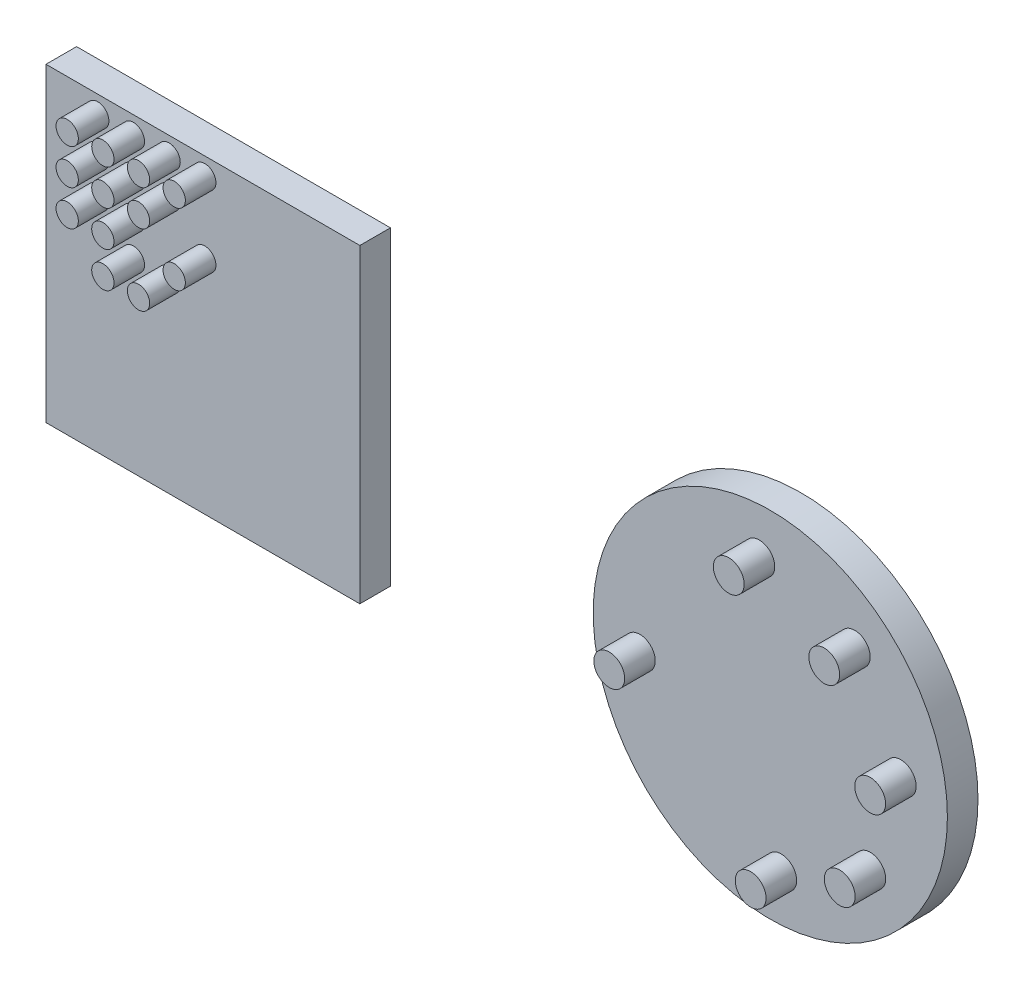
ISO-10303-21;
HEADER;
FILE_DESCRIPTION(('STEP AP214'),'2;1');
FILE_NAME('part.step','',(''),(''),'','','');
FILE_SCHEMA(('AUTOMOTIVE_DESIGN { 1 0 10303 214 1 1 1 1 }'));
ENDSEC;
DATA;
#1=APPLICATION_CONTEXT('core data for automotive mechanical design processes');
#2=APPLICATION_PROTOCOL_DEFINITION('international standard','automotive_design',2000,#1);
#3=PRODUCT_CONTEXT('',#1,'mechanical');
#4=PRODUCT('Part','Part','',(#3));
#5=PRODUCT_RELATED_PRODUCT_CATEGORY('part','',(#4));
#6=PRODUCT_DEFINITION_FORMATION('','',#4);
#7=PRODUCT_DEFINITION_CONTEXT('part definition',#1,'design');
#8=PRODUCT_DEFINITION('design','',#6,#7);
#9=PRODUCT_DEFINITION_SHAPE('','',#8);
#10=(LENGTH_UNIT() NAMED_UNIT(*) SI_UNIT(.MILLI.,.METRE.));
#11=(NAMED_UNIT(*) PLANE_ANGLE_UNIT() SI_UNIT($,.RADIAN.));
#12=(NAMED_UNIT(*) SI_UNIT($,.STERADIAN.) SOLID_ANGLE_UNIT());
#13=UNCERTAINTY_MEASURE_WITH_UNIT(LENGTH_MEASURE(1.E-05),#10,'distance_accuracy_value','');
#14=(GEOMETRIC_REPRESENTATION_CONTEXT(3) GLOBAL_UNCERTAINTY_ASSIGNED_CONTEXT((#13)) GLOBAL_UNIT_ASSIGNED_CONTEXT((#10,
#11,#12)) REPRESENTATION_CONTEXT('',''));
#15=CARTESIAN_POINT('',(0.,0.,0.));
#16=DIRECTION('',(0.,0.,1.));
#17=DIRECTION('',(1.,0.,0.));
#18=AXIS2_PLACEMENT_3D('',#15,#16,#17);
#19=CARTESIAN_POINT('',(1372.54032856538,-312.890998646338,60.));
#20=DIRECTION('',(0.,0.,-1.));
#21=DIRECTION('',(-1.,0.,0.));
#22=AXIS2_PLACEMENT_3D('',#19,#20,#21);
#23=CYLINDRICAL_SURFACE('',#22,347.526096984866);
#24=CARTESIAN_POINT('',(1372.54032856538,-312.890998646338,60.));
#25=DIRECTION('',(0.,0.,1.));
#26=DIRECTION('',(1.,0.,0.));
#27=AXIS2_PLACEMENT_3D('',#24,#25,#26);
#28=CIRCLE('',#27,347.526096984866);
#29=CARTESIAN_POINT('',(1720.06642555024,-312.890998646338,60.));
#30=VERTEX_POINT('',#29);
#31=EDGE_CURVE('E11',#30,#30,#28,.T.);
#32=ORIENTED_EDGE('',*,*,#31,.F.);
#33=EDGE_LOOP('',(#32));
#34=FACE_BOUND('',#33,.T.);
#35=CARTESIAN_POINT('',(1372.54032856538,-312.890998646338,0.));
#36=DIRECTION('',(0.,0.,1.));
#37=DIRECTION('',(1.,0.,0.));
#38=AXIS2_PLACEMENT_3D('',#35,#36,#37);
#39=CIRCLE('',#38,347.526096984866);
#40=CARTESIAN_POINT('',(1720.06642555024,-312.890998646338,0.));
#41=VERTEX_POINT('',#40);
#42=EDGE_CURVE('E46',#41,#41,#39,.T.);
#43=ORIENTED_EDGE('',*,*,#42,.T.);
#44=EDGE_LOOP('',(#43));
#45=FACE_BOUND('',#44,.T.);
#46=ADVANCED_FACE('F43',(#34,#45),#23,.T.);
#47=CARTESIAN_POINT('',(1372.54032856538,-312.890998646338,60.));
#48=DIRECTION('',(0.,0.,1.));
#49=DIRECTION('',(1.,0.,0.));
#50=AXIS2_PLACEMENT_3D('',#47,#48,#49);
#51=PLANE('',#50);
#52=CARTESIAN_POINT('',(1628.50942504009,-291.402980136955,60.));
#53=DIRECTION('',(0.,0.,1.));
#54=DIRECTION('',(0.707106781186556,-0.707106781186539,0.));
#55=AXIS2_PLACEMENT_3D('',#52,#53,#54);
#56=CIRCLE('',#55,30.2418001890678);
#57=CARTESIAN_POINT('',(1649.89360702907,-312.787162125933,60.));
#58=VERTEX_POINT('',#57);
#59=EDGE_CURVE('E85',#58,#58,#56,.T.);
#60=ORIENTED_EDGE('',*,*,#59,.F.);
#61=EDGE_LOOP('',(#60));
#62=FACE_BOUND('',#61,.T.);
#63=CARTESIAN_POINT('',(1568.73213605908,-478.694158935552,60.));
#64=DIRECTION('',(0.,0.,1.));
#65=DIRECTION('',(0.,-1.,0.));
#66=AXIS2_PLACEMENT_3D('',#63,#64,#65);
#67=CIRCLE('',#66,30.2418001890678);
#68=CARTESIAN_POINT('',(1568.73213605908,-508.935959124619,60.));
#69=VERTEX_POINT('',#68);
#70=EDGE_CURVE('E79',#69,#69,#67,.T.);
#71=ORIENTED_EDGE('',*,*,#70,.F.);
#72=EDGE_LOOP('',(#71));
#73=FACE_BOUND('',#72,.T.);
#74=CARTESIAN_POINT('',(1394.02834707476,-568.860095121047,60.));
#75=DIRECTION('',(0.,0.,1.));
#76=DIRECTION('',(-0.707106781186541,-0.707106781186554,0.));
#77=AXIS2_PLACEMENT_3D('',#74,#75,#76);
#78=CIRCLE('',#77,30.2418001890678);
#79=CARTESIAN_POINT('',(1372.64416508578,-590.244277110025,60.));
#80=VERTEX_POINT('',#79);
#81=EDGE_CURVE('E73',#80,#80,#78,.T.);
#82=ORIENTED_EDGE('',*,*,#81,.F.);
#83=EDGE_LOOP('',(#82));
#84=FACE_BOUND('',#83,.T.);
#85=CARTESIAN_POINT('',(1116.57123209067,-334.37901715572,60.));
#86=DIRECTION('',(0.,0.,1.));
#87=DIRECTION('',(-0.707106781186551,0.707106781186544,0.));
#88=AXIS2_PLACEMENT_3D('',#85,#86,#87);
#89=CIRCLE('',#88,30.2418001890678);
#90=CARTESIAN_POINT('',(1095.18705010169,-312.994835166741,60.));
#91=VERTEX_POINT('',#90);
#92=EDGE_CURVE('E67',#91,#91,#89,.T.);
#93=ORIENTED_EDGE('',*,*,#92,.F.);
#94=EDGE_LOOP('',(#93));
#95=FACE_BOUND('',#94,.T.);
#96=CARTESIAN_POINT('',(1351.052310056,-56.9219021716301,60.));
#97=DIRECTION('',(0.,0.,1.));
#98=DIRECTION('',(0.707106781186546,0.707106781186549,0.));
#99=AXIS2_PLACEMENT_3D('',#96,#97,#98);
#100=CIRCLE('',#99,30.2418001890678);
#101=CARTESIAN_POINT('',(1372.43649204498,-35.5377201826516,60.));
#102=VERTEX_POINT('',#101);
#103=EDGE_CURVE('E61',#102,#102,#100,.T.);
#104=ORIENTED_EDGE('',*,*,#103,.F.);
#105=EDGE_LOOP('',(#104));
#106=FACE_BOUND('',#105,.T.);
#107=CARTESIAN_POINT('',(1538.34348885459,-116.699191152634,60.));
#108=DIRECTION('',(0.,0.,1.));
#109=DIRECTION('',(1.,0.,0.));
#110=AXIS2_PLACEMENT_3D('',#107,#108,#109);
#111=CIRCLE('',#110,30.2418001890678);
#112=CARTESIAN_POINT('',(1568.58528904366,-116.699191152634,60.));
#113=VERTEX_POINT('',#112);
#114=EDGE_CURVE('E55',#113,#113,#111,.T.);
#115=ORIENTED_EDGE('',*,*,#114,.F.);
#116=EDGE_LOOP('',(#115));
#117=FACE_BOUND('',#116,.T.);
#118=ORIENTED_EDGE('',*,*,#31,.T.);
#119=EDGE_LOOP('',(#118));
#120=FACE_BOUND('',#119,.T.);
#121=ADVANCED_FACE('F100',(#62,#73,#84,#95,#106,#117,#120),#51,.T.);
#122=CARTESIAN_POINT('',(1372.54032856538,-312.890998646338,0.));
#123=DIRECTION('',(0.,0.,1.));
#124=DIRECTION('',(1.,0.,0.));
#125=AXIS2_PLACEMENT_3D('',#122,#123,#124);
#126=PLANE('',#125);
#127=ORIENTED_EDGE('',*,*,#42,.F.);
#128=EDGE_LOOP('',(#127));
#129=FACE_BOUND('',#128,.T.);
#130=ADVANCED_FACE('F103',(#129),#126,.F.);
#131=CARTESIAN_POINT('',(1538.34348885459,-116.699191152634,120.));
#132=DIRECTION('',(0.,0.,-1.));
#133=DIRECTION('',(-1.,0.,0.));
#134=AXIS2_PLACEMENT_3D('',#131,#132,#133);
#135=CYLINDRICAL_SURFACE('',#134,30.2418001890678);
#136=CARTESIAN_POINT('',(1538.34348885459,-116.699191152634,120.));
#137=DIRECTION('',(0.,0.,1.));
#138=DIRECTION('',(1.,0.,0.));
#139=AXIS2_PLACEMENT_3D('',#136,#137,#138);
#140=CIRCLE('',#139,30.2418001890678);
#141=CARTESIAN_POINT('',(1568.58528904366,-116.699191152634,120.));
#142=VERTEX_POINT('',#141);
#143=EDGE_CURVE('E53',#142,#142,#140,.T.);
#144=ORIENTED_EDGE('',*,*,#143,.F.);
#145=EDGE_LOOP('',(#144));
#146=FACE_BOUND('',#145,.T.);
#147=ORIENTED_EDGE('',*,*,#114,.T.);
#148=EDGE_LOOP('',(#147));
#149=FACE_BOUND('',#148,.T.);
#150=ADVANCED_FACE('F115',(#146,#149),#135,.T.);
#151=CARTESIAN_POINT('',(1538.34348885459,-116.699191152634,120.));
#152=DIRECTION('',(0.,0.,1.));
#153=DIRECTION('',(1.,0.,0.));
#154=AXIS2_PLACEMENT_3D('',#151,#152,#153);
#155=PLANE('',#154);
#156=ORIENTED_EDGE('',*,*,#143,.T.);
#157=EDGE_LOOP('',(#156));
#158=FACE_BOUND('',#157,.T.);
#159=ADVANCED_FACE('F117',(#158),#155,.T.);
#160=CARTESIAN_POINT('',(1351.052310056,-56.9219021716301,120.));
#161=DIRECTION('',(0.,0.,-1.));
#162=DIRECTION('',(-1.,0.,0.));
#163=AXIS2_PLACEMENT_3D('',#160,#161,#162);
#164=CYLINDRICAL_SURFACE('',#163,30.2418001890678);
#165=CARTESIAN_POINT('',(1351.052310056,-56.9219021716301,120.));
#166=DIRECTION('',(0.,0.,1.));
#167=DIRECTION('',(0.707106781186546,0.707106781186549,0.));
#168=AXIS2_PLACEMENT_3D('',#165,#166,#167);
#169=CIRCLE('',#168,30.2418001890678);
#170=CARTESIAN_POINT('',(1372.43649204498,-35.5377201826516,120.));
#171=VERTEX_POINT('',#170);
#172=EDGE_CURVE('E58',#171,#171,#169,.T.);
#173=ORIENTED_EDGE('',*,*,#172,.F.);
#174=EDGE_LOOP('',(#173));
#175=FACE_BOUND('',#174,.T.);
#176=ORIENTED_EDGE('',*,*,#103,.T.);
#177=EDGE_LOOP('',(#176));
#178=FACE_BOUND('',#177,.T.);
#179=ADVANCED_FACE('F124',(#175,#178),#164,.T.);
#180=CARTESIAN_POINT('',(1351.052310056,-56.9219021716301,120.));
#181=DIRECTION('',(0.,0.,1.));
#182=DIRECTION('',(0.707106781186546,0.707106781186549,0.));
#183=AXIS2_PLACEMENT_3D('',#180,#181,#182);
#184=PLANE('',#183);
#185=ORIENTED_EDGE('',*,*,#172,.T.);
#186=EDGE_LOOP('',(#185));
#187=FACE_BOUND('',#186,.T.);
#188=ADVANCED_FACE('F162',(#187),#184,.T.);
#189=CARTESIAN_POINT('',(1116.57123209067,-334.37901715572,120.));
#190=DIRECTION('',(0.,0.,-1.));
#191=DIRECTION('',(-1.,0.,0.));
#192=AXIS2_PLACEMENT_3D('',#189,#190,#191);
#193=CYLINDRICAL_SURFACE('',#192,30.2418001890678);
#194=CARTESIAN_POINT('',(1116.57123209067,-334.37901715572,120.));
#195=DIRECTION('',(0.,0.,1.));
#196=DIRECTION('',(-0.707106781186551,0.707106781186544,0.));
#197=AXIS2_PLACEMENT_3D('',#194,#195,#196);
#198=CIRCLE('',#197,30.2418001890678);
#199=CARTESIAN_POINT('',(1095.18705010169,-312.994835166741,120.));
#200=VERTEX_POINT('',#199);
#201=EDGE_CURVE('E64',#200,#200,#198,.T.);
#202=ORIENTED_EDGE('',*,*,#201,.F.);
#203=EDGE_LOOP('',(#202));
#204=FACE_BOUND('',#203,.T.);
#205=ORIENTED_EDGE('',*,*,#92,.T.);
#206=EDGE_LOOP('',(#205));
#207=FACE_BOUND('',#206,.T.);
#208=ADVANCED_FACE('F169',(#204,#207),#193,.T.);
#209=CARTESIAN_POINT('',(1116.57123209067,-334.37901715572,120.));
#210=DIRECTION('',(0.,0.,1.));
#211=DIRECTION('',(-0.707106781186551,0.707106781186544,0.));
#212=AXIS2_PLACEMENT_3D('',#209,#210,#211);
#213=PLANE('',#212);
#214=ORIENTED_EDGE('',*,*,#201,.T.);
#215=EDGE_LOOP('',(#214));
#216=FACE_BOUND('',#215,.T.);
#217=ADVANCED_FACE('F177',(#216),#213,.T.);
#218=CARTESIAN_POINT('',(1394.02834707476,-568.860095121047,120.));
#219=DIRECTION('',(0.,0.,-1.));
#220=DIRECTION('',(-1.,0.,0.));
#221=AXIS2_PLACEMENT_3D('',#218,#219,#220);
#222=CYLINDRICAL_SURFACE('',#221,30.2418001890678);
#223=CARTESIAN_POINT('',(1394.02834707476,-568.860095121047,120.));
#224=DIRECTION('',(0.,0.,1.));
#225=DIRECTION('',(-0.707106781186541,-0.707106781186554,0.));
#226=AXIS2_PLACEMENT_3D('',#223,#224,#225);
#227=CIRCLE('',#226,30.2418001890678);
#228=CARTESIAN_POINT('',(1372.64416508578,-590.244277110025,120.));
#229=VERTEX_POINT('',#228);
#230=EDGE_CURVE('E70',#229,#229,#227,.T.);
#231=ORIENTED_EDGE('',*,*,#230,.F.);
#232=EDGE_LOOP('',(#231));
#233=FACE_BOUND('',#232,.T.);
#234=ORIENTED_EDGE('',*,*,#81,.T.);
#235=EDGE_LOOP('',(#234));
#236=FACE_BOUND('',#235,.T.);
#237=ADVANCED_FACE('F185',(#233,#236),#222,.T.);
#238=CARTESIAN_POINT('',(1394.02834707476,-568.860095121047,120.));
#239=DIRECTION('',(0.,0.,1.));
#240=DIRECTION('',(-0.707106781186541,-0.707106781186554,0.));
#241=AXIS2_PLACEMENT_3D('',#238,#239,#240);
#242=PLANE('',#241);
#243=ORIENTED_EDGE('',*,*,#230,.T.);
#244=EDGE_LOOP('',(#243));
#245=FACE_BOUND('',#244,.T.);
#246=ADVANCED_FACE('F193',(#245),#242,.T.);
#247=CARTESIAN_POINT('',(1568.73213605908,-478.694158935552,120.));
#248=DIRECTION('',(0.,0.,-1.));
#249=DIRECTION('',(-1.,0.,0.));
#250=AXIS2_PLACEMENT_3D('',#247,#248,#249);
#251=CYLINDRICAL_SURFACE('',#250,30.2418001890678);
#252=CARTESIAN_POINT('',(1568.73213605908,-478.694158935552,120.));
#253=DIRECTION('',(0.,0.,1.));
#254=DIRECTION('',(0.,-1.,0.));
#255=AXIS2_PLACEMENT_3D('',#252,#253,#254);
#256=CIRCLE('',#255,30.2418001890678);
#257=CARTESIAN_POINT('',(1568.73213605908,-508.935959124619,120.));
#258=VERTEX_POINT('',#257);
#259=EDGE_CURVE('E76',#258,#258,#256,.T.);
#260=ORIENTED_EDGE('',*,*,#259,.F.);
#261=EDGE_LOOP('',(#260));
#262=FACE_BOUND('',#261,.T.);
#263=ORIENTED_EDGE('',*,*,#70,.T.);
#264=EDGE_LOOP('',(#263));
#265=FACE_BOUND('',#264,.T.);
#266=ADVANCED_FACE('F201',(#262,#265),#251,.T.);
#267=CARTESIAN_POINT('',(1568.73213605908,-478.694158935552,120.));
#268=DIRECTION('',(0.,0.,1.));
#269=DIRECTION('',(0.,-1.,0.));
#270=AXIS2_PLACEMENT_3D('',#267,#268,#269);
#271=PLANE('',#270);
#272=ORIENTED_EDGE('',*,*,#259,.T.);
#273=EDGE_LOOP('',(#272));
#274=FACE_BOUND('',#273,.T.);
#275=ADVANCED_FACE('F96',(#274),#271,.T.);
#276=CARTESIAN_POINT('',(1628.50942504009,-291.402980136955,120.));
#277=DIRECTION('',(0.,0.,-1.));
#278=DIRECTION('',(-1.,0.,0.));
#279=AXIS2_PLACEMENT_3D('',#276,#277,#278);
#280=CYLINDRICAL_SURFACE('',#279,30.2418001890678);
#281=CARTESIAN_POINT('',(1628.50942504009,-291.402980136955,120.));
#282=DIRECTION('',(0.,0.,1.));
#283=DIRECTION('',(0.707106781186556,-0.707106781186539,0.));
#284=AXIS2_PLACEMENT_3D('',#281,#282,#283);
#285=CIRCLE('',#284,30.2418001890678);
#286=CARTESIAN_POINT('',(1649.89360702907,-312.787162125933,120.));
#287=VERTEX_POINT('',#286);
#288=EDGE_CURVE('E82',#287,#287,#285,.T.);
#289=ORIENTED_EDGE('',*,*,#288,.F.);
#290=EDGE_LOOP('',(#289));
#291=FACE_BOUND('',#290,.T.);
#292=ORIENTED_EDGE('',*,*,#59,.T.);
#293=EDGE_LOOP('',(#292));
#294=FACE_BOUND('',#293,.T.);
#295=ADVANCED_FACE('F93',(#291,#294),#280,.T.);
#296=CARTESIAN_POINT('',(1628.50942504009,-291.402980136955,120.));
#297=DIRECTION('',(0.,0.,1.));
#298=DIRECTION('',(0.707106781186556,-0.707106781186539,0.));
#299=AXIS2_PLACEMENT_3D('',#296,#297,#298);
#300=PLANE('',#299);
#301=ORIENTED_EDGE('',*,*,#288,.T.);
#302=EDGE_LOOP('',(#301));
#303=FACE_BOUND('',#302,.T.);
#304=ADVANCED_FACE('F91',(#303),#300,.T.);
#305=CLOSED_SHELL('',(#46,#121,#130,#150,#159,#179,#188,#208,#217,#237,#246,#266,#275,#295,#304));
#306=MANIFOLD_SOLID_BREP('B2',#305);
#307=CARTESIAN_POINT('',(132.990324026212,-222.88264773561,60.));
#308=DIRECTION('',(0.,0.,1.));
#309=DIRECTION('',(1.,0.,0.));
#310=AXIS2_PLACEMENT_3D('',#307,#308,#309);
#311=PLANE('',#310);
#312=CARTESIAN_POINT('',(132.990324026212,-222.88264773561,60.));
#313=DIRECTION('',(0.,0.,1.));
#314=DIRECTION('',(1.,0.,0.));
#315=AXIS2_PLACEMENT_3D('',#312,#313,#314);
#316=CIRCLE('',#315,21.8715071447534);
#317=CARTESIAN_POINT('',(154.861831170966,-222.88264773561,60.));
#318=VERTEX_POINT('',#317);
#319=EDGE_CURVE('E41',#318,#318,#316,.T.);
#320=ORIENTED_EDGE('',*,*,#319,.T.);
#321=EDGE_LOOP('',(#320));
#322=FACE_BOUND('',#321,.T.);
#323=ADVANCED_FACE('F264',(#322),#311,.T.);
#324=CARTESIAN_POINT('',(132.990324026212,-222.88264773561,60.));
#325=DIRECTION('',(0.,0.,-1.));
#326=DIRECTION('',(-1.,0.,0.));
#327=AXIS2_PLACEMENT_3D('',#324,#325,#326);
#328=CYLINDRICAL_SURFACE('',#327,21.8715071447534);
#329=ORIENTED_EDGE('',*,*,#319,.F.);
#330=EDGE_LOOP('',(#329));
#331=FACE_BOUND('',#330,.T.);
#332=CARTESIAN_POINT('',(132.990324026212,-222.88264773561,0.));
#333=DIRECTION('',(0.,0.,1.));
#334=DIRECTION('',(1.,0.,0.));
#335=AXIS2_PLACEMENT_3D('',#332,#333,#334);
#336=CIRCLE('',#335,21.8715071447534);
#337=CARTESIAN_POINT('',(154.861831170966,-222.88264773561,0.));
#338=VERTEX_POINT('',#337);
#339=EDGE_CURVE('E272',#338,#338,#336,.T.);
#340=ORIENTED_EDGE('',*,*,#339,.T.);
#341=EDGE_LOOP('',(#340));
#342=FACE_BOUND('',#341,.T.);
#343=ADVANCED_FACE('F406',(#331,#342),#328,.T.);
#344=CARTESIAN_POINT('',(62.9903240262122,-222.88264773561,60.));
#345=DIRECTION('',(0.,0.,1.));
#346=DIRECTION('',(1.,0.,0.));
#347=AXIS2_PLACEMENT_3D('',#344,#345,#346);
#348=PLANE('',#347);
#349=CARTESIAN_POINT('',(62.9903240262122,-222.88264773561,60.));
#350=DIRECTION('',(0.,0.,1.));
#351=DIRECTION('',(1.,0.,0.));
#352=AXIS2_PLACEMENT_3D('',#349,#350,#351);
#353=CIRCLE('',#352,21.8715071447534);
#354=CARTESIAN_POINT('',(84.8618311709657,-222.88264773561,60.));
#355=VERTEX_POINT('',#354);
#356=EDGE_CURVE('E401',#355,#355,#353,.T.);
#357=ORIENTED_EDGE('',*,*,#356,.T.);
#358=EDGE_LOOP('',(#357));
#359=FACE_BOUND('',#358,.T.);
#360=ADVANCED_FACE('F430',(#359),#348,.T.);
#361=CARTESIAN_POINT('',(62.9903240262122,-222.88264773561,60.));
#362=DIRECTION('',(0.,0.,-1.));
#363=DIRECTION('',(-1.,0.,0.));
#364=AXIS2_PLACEMENT_3D('',#361,#362,#363);
#365=CYLINDRICAL_SURFACE('',#364,21.8715071447534);
#366=ORIENTED_EDGE('',*,*,#356,.F.);
#367=EDGE_LOOP('',(#366));
#368=FACE_BOUND('',#367,.T.);
#369=CARTESIAN_POINT('',(62.9903240262122,-222.88264773561,0.));
#370=DIRECTION('',(0.,0.,1.));
#371=DIRECTION('',(1.,0.,0.));
#372=AXIS2_PLACEMENT_3D('',#369,#370,#371);
#373=CIRCLE('',#372,21.8715071447534);
#374=CARTESIAN_POINT('',(84.8618311709657,-222.88264773561,0.));
#375=VERTEX_POINT('',#374);
#376=EDGE_CURVE('E398',#375,#375,#373,.T.);
#377=ORIENTED_EDGE('',*,*,#376,.T.);
#378=EDGE_LOOP('',(#377));
#379=FACE_BOUND('',#378,.T.);
#380=ADVANCED_FACE('F436',(#368,#379),#365,.T.);
#381=CARTESIAN_POINT('',(202.990324026212,-152.88264773561,60.));
#382=DIRECTION('',(0.,0.,1.));
#383=DIRECTION('',(1.,0.,0.));
#384=AXIS2_PLACEMENT_3D('',#381,#382,#383);
#385=PLANE('',#384);
#386=CARTESIAN_POINT('',(202.990324026212,-152.88264773561,60.));
#387=DIRECTION('',(0.,0.,1.));
#388=DIRECTION('',(1.,0.,0.));
#389=AXIS2_PLACEMENT_3D('',#386,#387,#388);
#390=CIRCLE('',#389,21.8715071447534);
#391=CARTESIAN_POINT('',(224.861831170966,-152.88264773561,60.));
#392=VERTEX_POINT('',#391);
#393=EDGE_CURVE('E395',#392,#392,#390,.T.);
#394=ORIENTED_EDGE('',*,*,#393,.T.);
#395=EDGE_LOOP('',(#394));
#396=FACE_BOUND('',#395,.T.);
#397=ADVANCED_FACE('F442',(#396),#385,.T.);
#398=CARTESIAN_POINT('',(202.990324026212,-152.88264773561,60.));
#399=DIRECTION('',(0.,0.,-1.));
#400=DIRECTION('',(-1.,0.,0.));
#401=AXIS2_PLACEMENT_3D('',#398,#399,#400);
#402=CYLINDRICAL_SURFACE('',#401,21.8715071447534);
#403=ORIENTED_EDGE('',*,*,#393,.F.);
#404=EDGE_LOOP('',(#403));
#405=FACE_BOUND('',#404,.T.);
#406=CARTESIAN_POINT('',(202.990324026212,-152.88264773561,0.));
#407=DIRECTION('',(0.,0.,1.));
#408=DIRECTION('',(1.,0.,0.));
#409=AXIS2_PLACEMENT_3D('',#406,#407,#408);
#410=CIRCLE('',#409,21.8715071447534);
#411=CARTESIAN_POINT('',(224.861831170966,-152.88264773561,0.));
#412=VERTEX_POINT('',#411);
#413=EDGE_CURVE('E392',#412,#412,#410,.T.);
#414=ORIENTED_EDGE('',*,*,#413,.T.);
#415=EDGE_LOOP('',(#414));
#416=FACE_BOUND('',#415,.T.);
#417=ADVANCED_FACE('F446',(#405,#416),#402,.T.);
#418=CARTESIAN_POINT('',(62.9903240262122,-152.88264773561,60.));
#419=DIRECTION('',(0.,0.,1.));
#420=DIRECTION('',(1.,0.,0.));
#421=AXIS2_PLACEMENT_3D('',#418,#419,#420);
#422=PLANE('',#421);
#423=CARTESIAN_POINT('',(62.9903240262122,-152.88264773561,60.));
#424=DIRECTION('',(0.,0.,1.));
#425=DIRECTION('',(1.,0.,0.));
#426=AXIS2_PLACEMENT_3D('',#423,#424,#425);
#427=CIRCLE('',#426,21.8715071447534);
#428=CARTESIAN_POINT('',(84.8618311709657,-152.88264773561,60.));
#429=VERTEX_POINT('',#428);
#430=EDGE_CURVE('E389',#429,#429,#427,.T.);
#431=ORIENTED_EDGE('',*,*,#430,.T.);
#432=EDGE_LOOP('',(#431));
#433=FACE_BOUND('',#432,.T.);
#434=ADVANCED_FACE('F450',(#433),#422,.T.);
#435=CARTESIAN_POINT('',(62.9903240262122,-152.88264773561,60.));
#436=DIRECTION('',(0.,0.,-1.));
#437=DIRECTION('',(-1.,0.,0.));
#438=AXIS2_PLACEMENT_3D('',#435,#436,#437);
#439=CYLINDRICAL_SURFACE('',#438,21.8715071447534);
#440=ORIENTED_EDGE('',*,*,#430,.F.);
#441=EDGE_LOOP('',(#440));
#442=FACE_BOUND('',#441,.T.);
#443=CARTESIAN_POINT('',(62.9903240262122,-152.88264773561,0.));
#444=DIRECTION('',(0.,0.,1.));
#445=DIRECTION('',(1.,0.,0.));
#446=AXIS2_PLACEMENT_3D('',#443,#444,#445);
#447=CIRCLE('',#446,21.8715071447534);
#448=CARTESIAN_POINT('',(84.8618311709657,-152.88264773561,0.));
#449=VERTEX_POINT('',#448);
#450=EDGE_CURVE('E386',#449,#449,#447,.T.);
#451=ORIENTED_EDGE('',*,*,#450,.T.);
#452=EDGE_LOOP('',(#451));
#453=FACE_BOUND('',#452,.T.);
#454=ADVANCED_FACE('F454',(#442,#453),#439,.T.);
#455=CARTESIAN_POINT('',(-7.00967597378777,-152.88264773561,60.));
#456=DIRECTION('',(0.,0.,1.));
#457=DIRECTION('',(1.,0.,0.));
#458=AXIS2_PLACEMENT_3D('',#455,#456,#457);
#459=PLANE('',#458);
#460=CARTESIAN_POINT('',(-7.00967597378777,-152.88264773561,60.));
#461=DIRECTION('',(0.,0.,1.));
#462=DIRECTION('',(1.,0.,0.));
#463=AXIS2_PLACEMENT_3D('',#460,#461,#462);
#464=CIRCLE('',#463,21.8715071447534);
#465=CARTESIAN_POINT('',(14.8618311709657,-152.88264773561,60.));
#466=VERTEX_POINT('',#465);
#467=EDGE_CURVE('E383',#466,#466,#464,.T.);
#468=ORIENTED_EDGE('',*,*,#467,.T.);
#469=EDGE_LOOP('',(#468));
#470=FACE_BOUND('',#469,.T.);
#471=ADVANCED_FACE('F458',(#470),#459,.T.);
#472=CARTESIAN_POINT('',(-7.00967597378777,-152.88264773561,60.));
#473=DIRECTION('',(0.,0.,-1.));
#474=DIRECTION('',(-1.,0.,0.));
#475=AXIS2_PLACEMENT_3D('',#472,#473,#474);
#476=CYLINDRICAL_SURFACE('',#475,21.8715071447534);
#477=ORIENTED_EDGE('',*,*,#467,.F.);
#478=EDGE_LOOP('',(#477));
#479=FACE_BOUND('',#478,.T.);
#480=CARTESIAN_POINT('',(-7.00967597378777,-152.88264773561,0.));
#481=DIRECTION('',(0.,0.,1.));
#482=DIRECTION('',(1.,0.,0.));
#483=AXIS2_PLACEMENT_3D('',#480,#481,#482);
#484=CIRCLE('',#483,21.8715071447534);
#485=CARTESIAN_POINT('',(14.8618311709657,-152.88264773561,0.));
#486=VERTEX_POINT('',#485);
#487=EDGE_CURVE('E380',#486,#486,#484,.T.);
#488=ORIENTED_EDGE('',*,*,#487,.T.);
#489=EDGE_LOOP('',(#488));
#490=FACE_BOUND('',#489,.T.);
#491=ADVANCED_FACE('F462',(#479,#490),#476,.T.);
#492=CARTESIAN_POINT('',(132.990324026212,-82.88264773561,60.));
#493=DIRECTION('',(0.,0.,1.));
#494=DIRECTION('',(1.,0.,0.));
#495=AXIS2_PLACEMENT_3D('',#492,#493,#494);
#496=PLANE('',#495);
#497=CARTESIAN_POINT('',(132.990324026212,-82.88264773561,60.));
#498=DIRECTION('',(0.,0.,1.));
#499=DIRECTION('',(1.,0.,0.));
#500=AXIS2_PLACEMENT_3D('',#497,#498,#499);
#501=CIRCLE('',#500,21.8715071447534);
#502=CARTESIAN_POINT('',(154.861831170966,-82.88264773561,60.));
#503=VERTEX_POINT('',#502);
#504=EDGE_CURVE('E377',#503,#503,#501,.T.);
#505=ORIENTED_EDGE('',*,*,#504,.T.);
#506=EDGE_LOOP('',(#505));
#507=FACE_BOUND('',#506,.T.);
#508=ADVANCED_FACE('F466',(#507),#496,.T.);
#509=CARTESIAN_POINT('',(132.990324026212,-82.88264773561,60.));
#510=DIRECTION('',(0.,0.,-1.));
#511=DIRECTION('',(-1.,0.,0.));
#512=AXIS2_PLACEMENT_3D('',#509,#510,#511);
#513=CYLINDRICAL_SURFACE('',#512,21.8715071447534);
#514=ORIENTED_EDGE('',*,*,#504,.F.);
#515=EDGE_LOOP('',(#514));
#516=FACE_BOUND('',#515,.T.);
#517=CARTESIAN_POINT('',(132.990324026212,-82.88264773561,0.));
#518=DIRECTION('',(0.,0.,1.));
#519=DIRECTION('',(1.,0.,0.));
#520=AXIS2_PLACEMENT_3D('',#517,#518,#519);
#521=CIRCLE('',#520,21.8715071447534);
#522=CARTESIAN_POINT('',(154.861831170966,-82.88264773561,0.));
#523=VERTEX_POINT('',#522);
#524=EDGE_CURVE('E374',#523,#523,#521,.T.);
#525=ORIENTED_EDGE('',*,*,#524,.T.);
#526=EDGE_LOOP('',(#525));
#527=FACE_BOUND('',#526,.T.);
#528=ADVANCED_FACE('F470',(#516,#527),#513,.T.);
#529=CARTESIAN_POINT('',(62.9903240262122,-82.88264773561,60.));
#530=DIRECTION('',(0.,0.,1.));
#531=DIRECTION('',(1.,0.,0.));
#532=AXIS2_PLACEMENT_3D('',#529,#530,#531);
#533=PLANE('',#532);
#534=CARTESIAN_POINT('',(62.9903240262122,-82.88264773561,60.));
#535=DIRECTION('',(0.,0.,1.));
#536=DIRECTION('',(1.,0.,0.));
#537=AXIS2_PLACEMENT_3D('',#534,#535,#536);
#538=CIRCLE('',#537,21.8715071447534);
#539=CARTESIAN_POINT('',(84.8618311709657,-82.88264773561,60.));
#540=VERTEX_POINT('',#539);
#541=EDGE_CURVE('E371',#540,#540,#538,.T.);
#542=ORIENTED_EDGE('',*,*,#541,.T.);
#543=EDGE_LOOP('',(#542));
#544=FACE_BOUND('',#543,.T.);
#545=ADVANCED_FACE('F474',(#544),#533,.T.);
#546=CARTESIAN_POINT('',(62.9903240262122,-82.88264773561,60.));
#547=DIRECTION('',(0.,0.,-1.));
#548=DIRECTION('',(-1.,0.,0.));
#549=AXIS2_PLACEMENT_3D('',#546,#547,#548);
#550=CYLINDRICAL_SURFACE('',#549,21.8715071447534);
#551=ORIENTED_EDGE('',*,*,#541,.F.);
#552=EDGE_LOOP('',(#551));
#553=FACE_BOUND('',#552,.T.);
#554=CARTESIAN_POINT('',(62.9903240262122,-82.88264773561,0.));
#555=DIRECTION('',(0.,0.,1.));
#556=DIRECTION('',(1.,0.,0.));
#557=AXIS2_PLACEMENT_3D('',#554,#555,#556);
#558=CIRCLE('',#557,21.8715071447534);
#559=CARTESIAN_POINT('',(84.8618311709657,-82.88264773561,0.));
#560=VERTEX_POINT('',#559);
#561=EDGE_CURVE('E368',#560,#560,#558,.T.);
#562=ORIENTED_EDGE('',*,*,#561,.T.);
#563=EDGE_LOOP('',(#562));
#564=FACE_BOUND('',#563,.T.);
#565=ADVANCED_FACE('F478',(#553,#564),#550,.T.);
#566=CARTESIAN_POINT('',(-7.00967597378777,-82.88264773561,60.));
#567=DIRECTION('',(0.,0.,1.));
#568=DIRECTION('',(1.,0.,0.));
#569=AXIS2_PLACEMENT_3D('',#566,#567,#568);
#570=PLANE('',#569);
#571=CARTESIAN_POINT('',(-7.00967597378777,-82.88264773561,60.));
#572=DIRECTION('',(0.,0.,1.));
#573=DIRECTION('',(1.,0.,0.));
#574=AXIS2_PLACEMENT_3D('',#571,#572,#573);
#575=CIRCLE('',#574,21.8715071447534);
#576=CARTESIAN_POINT('',(14.8618311709657,-82.88264773561,60.));
#577=VERTEX_POINT('',#576);
#578=EDGE_CURVE('E365',#577,#577,#575,.T.);
#579=ORIENTED_EDGE('',*,*,#578,.T.);
#580=EDGE_LOOP('',(#579));
#581=FACE_BOUND('',#580,.T.);
#582=ADVANCED_FACE('F482',(#581),#570,.T.);
#583=CARTESIAN_POINT('',(-7.00967597378777,-82.88264773561,60.));
#584=DIRECTION('',(0.,0.,-1.));
#585=DIRECTION('',(-1.,0.,0.));
#586=AXIS2_PLACEMENT_3D('',#583,#584,#585);
#587=CYLINDRICAL_SURFACE('',#586,21.8715071447534);
#588=ORIENTED_EDGE('',*,*,#578,.F.);
#589=EDGE_LOOP('',(#588));
#590=FACE_BOUND('',#589,.T.);
#591=CARTESIAN_POINT('',(-7.00967597378777,-82.88264773561,0.));
#592=DIRECTION('',(0.,0.,1.));
#593=DIRECTION('',(1.,0.,0.));
#594=AXIS2_PLACEMENT_3D('',#591,#592,#593);
#595=CIRCLE('',#594,21.8715071447534);
#596=CARTESIAN_POINT('',(14.8618311709657,-82.88264773561,0.));
#597=VERTEX_POINT('',#596);
#598=EDGE_CURVE('E362',#597,#597,#595,.T.);
#599=ORIENTED_EDGE('',*,*,#598,.T.);
#600=EDGE_LOOP('',(#599));
#601=FACE_BOUND('',#600,.T.);
#602=ADVANCED_FACE('F486',(#590,#601),#587,.T.);
#603=CARTESIAN_POINT('',(202.990324026212,-12.88264773561,60.));
#604=DIRECTION('',(0.,0.,1.));
#605=DIRECTION('',(1.,0.,0.));
#606=AXIS2_PLACEMENT_3D('',#603,#604,#605);
#607=PLANE('',#606);
#608=CARTESIAN_POINT('',(202.990324026212,-12.88264773561,60.));
#609=DIRECTION('',(0.,0.,1.));
#610=DIRECTION('',(1.,0.,0.));
#611=AXIS2_PLACEMENT_3D('',#608,#609,#610);
#612=CIRCLE('',#611,21.8715071447534);
#613=CARTESIAN_POINT('',(224.861831170966,-12.88264773561,60.));
#614=VERTEX_POINT('',#613);
#615=EDGE_CURVE('E359',#614,#614,#612,.T.);
#616=ORIENTED_EDGE('',*,*,#615,.T.);
#617=EDGE_LOOP('',(#616));
#618=FACE_BOUND('',#617,.T.);
#619=ADVANCED_FACE('F490',(#618),#607,.T.);
#620=CARTESIAN_POINT('',(202.990324026212,-12.88264773561,60.));
#621=DIRECTION('',(0.,0.,-1.));
#622=DIRECTION('',(-1.,0.,0.));
#623=AXIS2_PLACEMENT_3D('',#620,#621,#622);
#624=CYLINDRICAL_SURFACE('',#623,21.8715071447534);
#625=ORIENTED_EDGE('',*,*,#615,.F.);
#626=EDGE_LOOP('',(#625));
#627=FACE_BOUND('',#626,.T.);
#628=CARTESIAN_POINT('',(202.990324026212,-12.88264773561,0.));
#629=DIRECTION('',(0.,0.,1.));
#630=DIRECTION('',(1.,0.,0.));
#631=AXIS2_PLACEMENT_3D('',#628,#629,#630);
#632=CIRCLE('',#631,21.8715071447534);
#633=CARTESIAN_POINT('',(224.861831170966,-12.88264773561,0.));
#634=VERTEX_POINT('',#633);
#635=EDGE_CURVE('E356',#634,#634,#632,.T.);
#636=ORIENTED_EDGE('',*,*,#635,.T.);
#637=EDGE_LOOP('',(#636));
#638=FACE_BOUND('',#637,.T.);
#639=ADVANCED_FACE('F494',(#627,#638),#624,.T.);
#640=CARTESIAN_POINT('',(132.990324026212,-12.88264773561,60.));
#641=DIRECTION('',(0.,0.,1.));
#642=DIRECTION('',(1.,0.,0.));
#643=AXIS2_PLACEMENT_3D('',#640,#641,#642);
#644=PLANE('',#643);
#645=CARTESIAN_POINT('',(132.990324026212,-12.88264773561,60.));
#646=DIRECTION('',(0.,0.,1.));
#647=DIRECTION('',(1.,0.,0.));
#648=AXIS2_PLACEMENT_3D('',#645,#646,#647);
#649=CIRCLE('',#648,21.8715071447534);
#650=CARTESIAN_POINT('',(154.861831170966,-12.88264773561,60.));
#651=VERTEX_POINT('',#650);
#652=EDGE_CURVE('E353',#651,#651,#649,.T.);
#653=ORIENTED_EDGE('',*,*,#652,.T.);
#654=EDGE_LOOP('',(#653));
#655=FACE_BOUND('',#654,.T.);
#656=ADVANCED_FACE('F498',(#655),#644,.T.);
#657=CARTESIAN_POINT('',(132.990324026212,-12.88264773561,60.));
#658=DIRECTION('',(0.,0.,-1.));
#659=DIRECTION('',(-1.,0.,0.));
#660=AXIS2_PLACEMENT_3D('',#657,#658,#659);
#661=CYLINDRICAL_SURFACE('',#660,21.8715071447534);
#662=ORIENTED_EDGE('',*,*,#652,.F.);
#663=EDGE_LOOP('',(#662));
#664=FACE_BOUND('',#663,.T.);
#665=CARTESIAN_POINT('',(132.990324026212,-12.88264773561,0.));
#666=DIRECTION('',(0.,0.,1.));
#667=DIRECTION('',(1.,0.,0.));
#668=AXIS2_PLACEMENT_3D('',#665,#666,#667);
#669=CIRCLE('',#668,21.8715071447534);
#670=CARTESIAN_POINT('',(154.861831170966,-12.88264773561,0.));
#671=VERTEX_POINT('',#670);
#672=EDGE_CURVE('E350',#671,#671,#669,.T.);
#673=ORIENTED_EDGE('',*,*,#672,.T.);
#674=EDGE_LOOP('',(#673));
#675=FACE_BOUND('',#674,.T.);
#676=ADVANCED_FACE('F502',(#664,#675),#661,.T.);
#677=CARTESIAN_POINT('',(-7.00967597378777,-12.88264773561,60.));
#678=DIRECTION('',(0.,0.,-1.));
#679=DIRECTION('',(-1.,0.,0.));
#680=AXIS2_PLACEMENT_3D('',#677,#678,#679);
#681=CYLINDRICAL_SURFACE('',#680,21.8715071447534);
#682=CARTESIAN_POINT('',(-7.00967597378777,-12.88264773561,60.));
#683=DIRECTION('',(0.,0.,1.));
#684=DIRECTION('',(1.,0.,0.));
#685=AXIS2_PLACEMENT_3D('',#682,#683,#684);
#686=CIRCLE('',#685,21.8715071447534);
#687=CARTESIAN_POINT('',(14.8618311709657,-12.88264773561,60.));
#688=VERTEX_POINT('',#687);
#689=EDGE_CURVE('E342',#688,#688,#686,.T.);
#690=ORIENTED_EDGE('',*,*,#689,.F.);
#691=EDGE_LOOP('',(#690));
#692=FACE_BOUND('',#691,.T.);
#693=CARTESIAN_POINT('',(-7.00967597378777,-12.88264773561,0.));
#694=DIRECTION('',(0.,0.,1.));
#695=DIRECTION('',(1.,0.,0.));
#696=AXIS2_PLACEMENT_3D('',#693,#694,#695);
#697=CIRCLE('',#696,21.8715071447534);
#698=CARTESIAN_POINT('',(14.8618311709657,-12.88264773561,0.));
#699=VERTEX_POINT('',#698);
#700=EDGE_CURVE('E341',#699,#699,#697,.T.);
#701=ORIENTED_EDGE('',*,*,#700,.T.);
#702=EDGE_LOOP('',(#701));
#703=FACE_BOUND('',#702,.T.);
#704=ADVANCED_FACE('F506',(#692,#703),#681,.T.);
#705=CARTESIAN_POINT('',(-7.00967597378777,-12.88264773561,60.));
#706=DIRECTION('',(0.,0.,1.));
#707=DIRECTION('',(1.,0.,0.));
#708=AXIS2_PLACEMENT_3D('',#705,#706,#707);
#709=PLANE('',#708);
#710=ORIENTED_EDGE('',*,*,#689,.T.);
#711=EDGE_LOOP('',(#710));
#712=FACE_BOUND('',#711,.T.);
#713=ADVANCED_FACE('F510',(#712),#709,.T.);
#714=CARTESIAN_POINT('',(507.212564136239,21.9086961974799,-60.));
#715=DIRECTION('',(-1.,0.,0.));
#716=DIRECTION('',(0.,-1.,0.));
#717=AXIS2_PLACEMENT_3D('',#714,#715,#716);
#718=PLANE('',#717);
#719=DIRECTION('',(0.,-1.,0.));
#720=VECTOR('',#719,1.);
#721=CARTESIAN_POINT('',(507.212564136239,21.9086961974799,0.));
#722=LINE('',#721,#720);
#723=CARTESIAN_POINT('',(507.212564136239,21.9086961974799,0.));
#724=VERTEX_POINT('',#723);
#725=CARTESIAN_POINT('',(507.212564136239,-587.048949750647,0.));
#726=VERTEX_POINT('',#725);
#727=EDGE_CURVE('E331',#724,#726,#722,.T.);
#728=ORIENTED_EDGE('',*,*,#727,.T.);
#729=DIRECTION('',(0.,0.,1.));
#730=VECTOR('',#729,1.);
#731=CARTESIAN_POINT('',(507.212564136239,-587.048949750647,-60.));
#732=LINE('',#731,#730);
#733=CARTESIAN_POINT('',(507.212564136239,-587.048949750647,-60.));
#734=VERTEX_POINT('',#733);
#735=EDGE_CURVE('E322',#734,#726,#732,.T.);
#736=ORIENTED_EDGE('',*,*,#735,.F.);
#737=DIRECTION('',(0.,-1.,0.));
#738=VECTOR('',#737,1.);
#739=CARTESIAN_POINT('',(507.212564136239,21.9086961974799,-60.));
#740=LINE('',#739,#738);
#741=CARTESIAN_POINT('',(507.212564136239,21.9086961974799,-60.));
#742=VERTEX_POINT('',#741);
#743=EDGE_CURVE('E316',#742,#734,#740,.T.);
#744=ORIENTED_EDGE('',*,*,#743,.F.);
#745=DIRECTION('',(0.,0.,1.));
#746=VECTOR('',#745,1.);
#747=CARTESIAN_POINT('',(507.212564136239,21.9086961974799,-60.));
#748=LINE('',#747,#746);
#749=EDGE_CURVE('E327',#742,#724,#748,.T.);
#750=ORIENTED_EDGE('',*,*,#749,.T.);
#751=EDGE_LOOP('',(#728,#736,#744,#750));
#752=FACE_BOUND('',#751,.T.);
#753=ADVANCED_FACE('F514',(#752),#718,.F.);
#754=CARTESIAN_POINT('',(507.212564136239,-587.048949750647,-60.));
#755=DIRECTION('',(0.,1.,0.));
#756=DIRECTION('',(0.,0.,1.));
#757=AXIS2_PLACEMENT_3D('',#754,#755,#756);
#758=PLANE('',#757);
#759=DIRECTION('',(-1.,0.,0.));
#760=VECTOR('',#759,1.);
#761=CARTESIAN_POINT('',(507.212564136239,-587.048949750647,0.));
#762=LINE('',#761,#760);
#763=CARTESIAN_POINT('',(-108.573581249914,-587.048949750647,0.));
#764=VERTEX_POINT('',#763);
#765=EDGE_CURVE('E321',#726,#764,#762,.T.);
#766=ORIENTED_EDGE('',*,*,#765,.T.);
#767=DIRECTION('',(0.,0.,1.));
#768=VECTOR('',#767,1.);
#769=CARTESIAN_POINT('',(-108.573581249914,-587.048949750647,-60.));
#770=LINE('',#769,#768);
#771=CARTESIAN_POINT('',(-108.573581249914,-587.048949750647,-60.));
#772=VERTEX_POINT('',#771);
#773=EDGE_CURVE('E319',#772,#764,#770,.T.);
#774=ORIENTED_EDGE('',*,*,#773,.F.);
#775=DIRECTION('',(-1.,0.,0.));
#776=VECTOR('',#775,1.);
#777=CARTESIAN_POINT('',(507.212564136239,-587.048949750647,-60.));
#778=LINE('',#777,#776);
#779=EDGE_CURVE('E311',#734,#772,#778,.T.);
#780=ORIENTED_EDGE('',*,*,#779,.F.);
#781=ORIENTED_EDGE('',*,*,#735,.T.);
#782=EDGE_LOOP('',(#766,#774,#780,#781));
#783=FACE_BOUND('',#782,.T.);
#784=ADVANCED_FACE('F320',(#783),#758,.F.);
#785=CARTESIAN_POINT('',(-108.573581249914,21.9086961974799,-60.));
#786=DIRECTION('',(1.,0.,0.));
#787=DIRECTION('',(0.,0.,-1.));
#788=AXIS2_PLACEMENT_3D('',#785,#786,#787);
#789=PLANE('',#788);
#790=DIRECTION('',(0.,1.,0.));
#791=VECTOR('',#790,1.);
#792=CARTESIAN_POINT('',(-108.573581249914,21.9086961974799,0.));
#793=LINE('',#792,#791);
#794=CARTESIAN_POINT('',(-108.573581249914,21.9086961974799,0.));
#795=VERTEX_POINT('',#794);
#796=EDGE_CURVE('E297',#764,#795,#793,.T.);
#797=ORIENTED_EDGE('',*,*,#796,.T.);
#798=DIRECTION('',(0.,0.,1.));
#799=VECTOR('',#798,1.);
#800=CARTESIAN_POINT('',(-108.573581249914,21.9086961974799,-60.));
#801=LINE('',#800,#799);
#802=CARTESIAN_POINT('',(-108.573581249914,21.9086961974799,-60.));
#803=VERTEX_POINT('',#802);
#804=EDGE_CURVE('E323',#803,#795,#801,.T.);
#805=ORIENTED_EDGE('',*,*,#804,.F.);
#806=DIRECTION('',(0.,1.,0.));
#807=VECTOR('',#806,1.);
#808=CARTESIAN_POINT('',(-108.573581249914,21.9086961974799,-60.));
#809=LINE('',#808,#807);
#810=EDGE_CURVE('E314',#772,#803,#809,.T.);
#811=ORIENTED_EDGE('',*,*,#810,.F.);
#812=ORIENTED_EDGE('',*,*,#773,.T.);
#813=EDGE_LOOP('',(#797,#805,#811,#812));
#814=FACE_BOUND('',#813,.T.);
#815=ADVANCED_FACE('F325',(#814),#789,.F.);
#816=CARTESIAN_POINT('',(507.212564136239,21.9086961974799,-60.));
#817=DIRECTION('',(0.,-1.,0.));
#818=DIRECTION('',(0.,0.,-1.));
#819=AXIS2_PLACEMENT_3D('',#816,#817,#818);
#820=PLANE('',#819);
#821=DIRECTION('',(1.,0.,0.));
#822=VECTOR('',#821,1.);
#823=CARTESIAN_POINT('',(507.212564136239,21.9086961974799,0.));
#824=LINE('',#823,#822);
#825=EDGE_CURVE('E303',#795,#724,#824,.T.);
#826=ORIENTED_EDGE('',*,*,#825,.T.);
#827=ORIENTED_EDGE('',*,*,#749,.F.);
#828=DIRECTION('',(1.,0.,0.));
#829=VECTOR('',#828,1.);
#830=CARTESIAN_POINT('',(507.212564136239,21.9086961974799,-60.));
#831=LINE('',#830,#829);
#832=EDGE_CURVE('E280',#803,#742,#831,.T.);
#833=ORIENTED_EDGE('',*,*,#832,.F.);
#834=ORIENTED_EDGE('',*,*,#804,.T.);
#835=EDGE_LOOP('',(#826,#827,#833,#834));
#836=FACE_BOUND('',#835,.T.);
#837=ADVANCED_FACE('F420',(#836),#820,.F.);
#838=CARTESIAN_POINT('',(0.,0.,-60.));
#839=DIRECTION('',(0.,0.,-1.));
#840=DIRECTION('',(-1.,0.,0.));
#841=AXIS2_PLACEMENT_3D('',#838,#839,#840);
#842=PLANE('',#841);
#843=ORIENTED_EDGE('',*,*,#743,.T.);
#844=ORIENTED_EDGE('',*,*,#779,.T.);
#845=ORIENTED_EDGE('',*,*,#810,.T.);
#846=ORIENTED_EDGE('',*,*,#832,.T.);
#847=EDGE_LOOP('',(#843,#844,#845,#846));
#848=FACE_BOUND('',#847,.T.);
#849=ADVANCED_FACE('F312',(#848),#842,.T.);
#850=CARTESIAN_POINT('',(0.,0.,0.));
#851=DIRECTION('',(0.,0.,-1.));
#852=DIRECTION('',(-1.,0.,0.));
#853=AXIS2_PLACEMENT_3D('',#850,#851,#852);
#854=PLANE('',#853);
#855=CARTESIAN_POINT('',(62.9903240262122,-12.88264773561,0.));
#856=DIRECTION('',(0.,0.,-1.));
#857=DIRECTION('',(-1.,0.,0.));
#858=AXIS2_PLACEMENT_3D('',#855,#856,#857);
#859=CIRCLE('',#858,21.8715071447534);
#860=CARTESIAN_POINT('',(41.1188168814588,-12.88264773561,0.));
#861=VERTEX_POINT('',#860);
#862=EDGE_CURVE('E345',#861,#861,#859,.F.);
#863=ORIENTED_EDGE('',*,*,#862,.F.);
#864=EDGE_LOOP('',(#863));
#865=FACE_BOUND('',#864,.T.);
#866=ORIENTED_EDGE('',*,*,#700,.F.);
#867=EDGE_LOOP('',(#866));
#868=FACE_BOUND('',#867,.T.);
#869=ORIENTED_EDGE('',*,*,#727,.F.);
#870=ORIENTED_EDGE('',*,*,#825,.F.);
#871=ORIENTED_EDGE('',*,*,#796,.F.);
#872=ORIENTED_EDGE('',*,*,#765,.F.);
#873=EDGE_LOOP('',(#869,#870,#871,#872));
#874=FACE_BOUND('',#873,.T.);
#875=ORIENTED_EDGE('',*,*,#672,.F.);
#876=EDGE_LOOP('',(#875));
#877=FACE_BOUND('',#876,.T.);
#878=ORIENTED_EDGE('',*,*,#635,.F.);
#879=EDGE_LOOP('',(#878));
#880=FACE_BOUND('',#879,.T.);
#881=ORIENTED_EDGE('',*,*,#598,.F.);
#882=EDGE_LOOP('',(#881));
#883=FACE_BOUND('',#882,.T.);
#884=ORIENTED_EDGE('',*,*,#561,.F.);
#885=EDGE_LOOP('',(#884));
#886=FACE_BOUND('',#885,.T.);
#887=ORIENTED_EDGE('',*,*,#524,.F.);
#888=EDGE_LOOP('',(#887));
#889=FACE_BOUND('',#888,.T.);
#890=ORIENTED_EDGE('',*,*,#487,.F.);
#891=EDGE_LOOP('',(#890));
#892=FACE_BOUND('',#891,.T.);
#893=ORIENTED_EDGE('',*,*,#450,.F.);
#894=EDGE_LOOP('',(#893));
#895=FACE_BOUND('',#894,.T.);
#896=ORIENTED_EDGE('',*,*,#413,.F.);
#897=EDGE_LOOP('',(#896));
#898=FACE_BOUND('',#897,.T.);
#899=ORIENTED_EDGE('',*,*,#376,.F.);
#900=EDGE_LOOP('',(#899));
#901=FACE_BOUND('',#900,.T.);
#902=ORIENTED_EDGE('',*,*,#339,.F.);
#903=EDGE_LOOP('',(#902));
#904=FACE_BOUND('',#903,.T.);
#905=ADVANCED_FACE('F408',(#865,#868,#874,#877,#880,#883,#886,#889,#892,#895,#898,#901,#904),
#854,.F.);
#906=CARTESIAN_POINT('',(62.9903240262122,-12.88264773561,60.));
#907=DIRECTION('',(0.,0.,-1.));
#908=DIRECTION('',(-1.,0.,0.));
#909=AXIS2_PLACEMENT_3D('',#906,#907,#908);
#910=CYLINDRICAL_SURFACE('',#909,21.8715071447534);
#911=CARTESIAN_POINT('',(62.9903240262122,-12.88264773561,60.));
#912=DIRECTION('',(0.,0.,1.));
#913=DIRECTION('',(1.,0.,0.));
#914=AXIS2_PLACEMENT_3D('',#911,#912,#913);
#915=CIRCLE('',#914,21.8715071447534);
#916=CARTESIAN_POINT('',(84.8618311709657,-12.88264773561,60.));
#917=VERTEX_POINT('',#916);
#918=EDGE_CURVE('E334',#917,#917,#915,.T.);
#919=ORIENTED_EDGE('',*,*,#918,.F.);
#920=EDGE_LOOP('',(#919));
#921=FACE_BOUND('',#920,.T.);
#922=ORIENTED_EDGE('',*,*,#862,.T.);
#923=EDGE_LOOP('',(#922));
#924=FACE_BOUND('',#923,.T.);
#925=ADVANCED_FACE('F410',(#921,#924),#910,.T.);
#926=CARTESIAN_POINT('',(62.9903240262122,-12.88264773561,60.));
#927=DIRECTION('',(0.,0.,1.));
#928=DIRECTION('',(1.,0.,0.));
#929=AXIS2_PLACEMENT_3D('',#926,#927,#928);
#930=PLANE('',#929);
#931=ORIENTED_EDGE('',*,*,#918,.T.);
#932=EDGE_LOOP('',(#931));
#933=FACE_BOUND('',#932,.T.);
#934=ADVANCED_FACE('F417',(#933),#930,.T.);
#935=CLOSED_SHELL('',(#323,#343,#360,#380,#397,#417,#434,#454,#471,#491,#508,#528,#545,#565,
#582,#602,#619,#639,#656,#676,#704,#713,#753,#784,#815,#837,#849,#905,#925,#934));
#936=MANIFOLD_SOLID_BREP('B6',#935);
#937=ADVANCED_BREP_SHAPE_REPRESENTATION('',(#18,#306,#936),#14);
#938=SHAPE_DEFINITION_REPRESENTATION(#9,#937);
ENDSEC;
END-ISO-10303-21;
